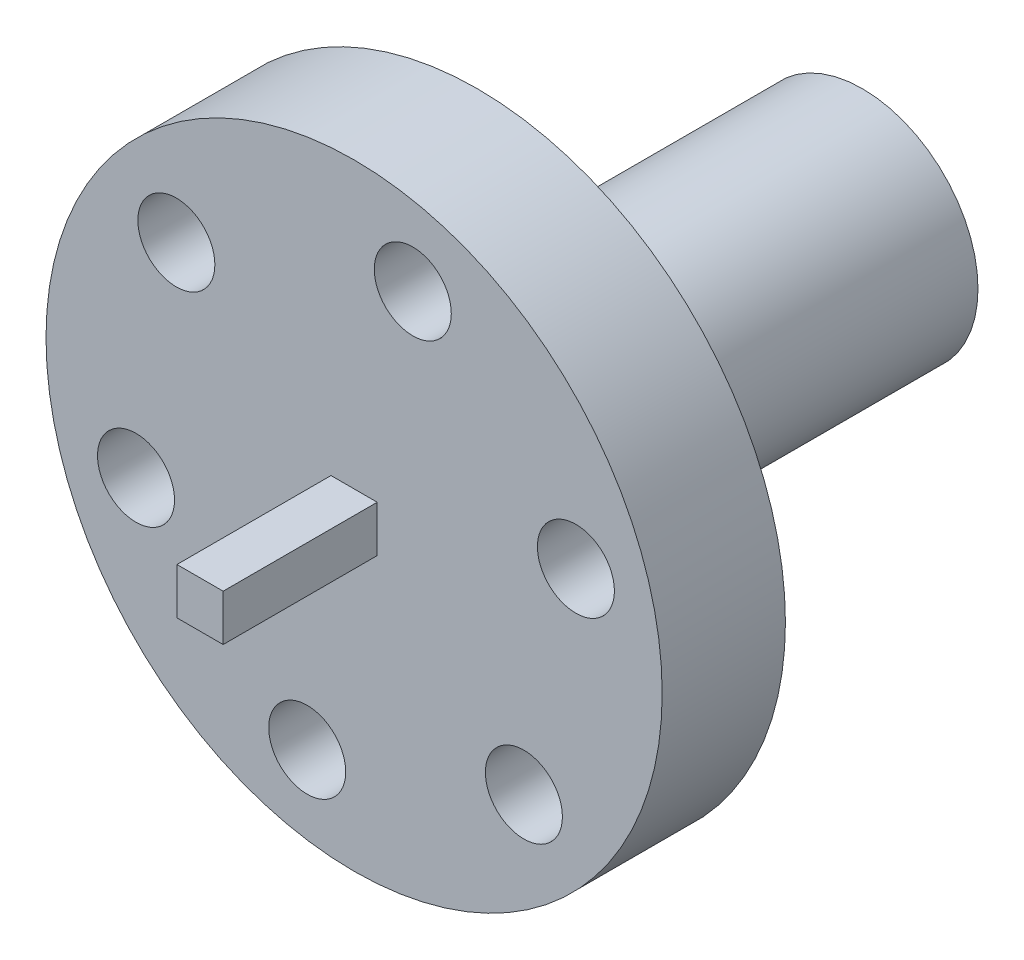
ISO-10303-21;
HEADER;
FILE_DESCRIPTION(('STEP AP214'),'2;1');
FILE_NAME('part.step','',(''),(''),'','','');
FILE_SCHEMA(('AUTOMOTIVE_DESIGN { 1 0 10303 214 1 1 1 1 }'));
ENDSEC;
DATA;
#1=APPLICATION_CONTEXT('core data for automotive mechanical design processes');
#2=APPLICATION_PROTOCOL_DEFINITION('international standard','automotive_design',2000,#1);
#3=PRODUCT_CONTEXT('',#1,'mechanical');
#4=PRODUCT('Part','Part','',(#3));
#5=PRODUCT_RELATED_PRODUCT_CATEGORY('part','',(#4));
#6=PRODUCT_DEFINITION_FORMATION('','',#4);
#7=PRODUCT_DEFINITION_CONTEXT('part definition',#1,'design');
#8=PRODUCT_DEFINITION('design','',#6,#7);
#9=PRODUCT_DEFINITION_SHAPE('','',#8);
#10=(LENGTH_UNIT() NAMED_UNIT(*) SI_UNIT(.MILLI.,.METRE.));
#11=(NAMED_UNIT(*) PLANE_ANGLE_UNIT() SI_UNIT($,.RADIAN.));
#12=(NAMED_UNIT(*) SI_UNIT($,.STERADIAN.) SOLID_ANGLE_UNIT());
#13=UNCERTAINTY_MEASURE_WITH_UNIT(LENGTH_MEASURE(1.E-05),#10,'distance_accuracy_value','');
#14=(GEOMETRIC_REPRESENTATION_CONTEXT(3) GLOBAL_UNCERTAINTY_ASSIGNED_CONTEXT((#13)) GLOBAL_UNIT_ASSIGNED_CONTEXT((#10,
#11,#12)) REPRESENTATION_CONTEXT('',''));
#15=CARTESIAN_POINT('',(0.,0.,0.));
#16=DIRECTION('',(0.,0.,1.));
#17=DIRECTION('',(1.,0.,0.));
#18=AXIS2_PLACEMENT_3D('',#15,#16,#17);
#19=CARTESIAN_POINT('',(0.,0.,8.));
#20=DIRECTION('',(0.,0.,1.));
#21=DIRECTION('',(1.,0.,0.));
#22=AXIS2_PLACEMENT_3D('',#19,#20,#21);
#23=PLANE('',#22);
#24=CARTESIAN_POINT('',(-14.1573634779161,-4.95493457320838,8.));
#25=DIRECTION('',(0.,0.,1.));
#26=DIRECTION('',(1.,0.,0.));
#27=AXIS2_PLACEMENT_3D('',#24,#25,#26);
#28=CIRCLE('',#27,2.5);
#29=CARTESIAN_POINT('',(-11.6573634779161,-4.95493457320838,8.));
#30=VERTEX_POINT('',#29);
#31=EDGE_CURVE('E144',#30,#30,#28,.T.);
#32=ORIENTED_EDGE('',*,*,#31,.F.);
#33=EDGE_LOOP('',(#32));
#34=FACE_BOUND('',#33,.T.);
#35=CARTESIAN_POINT('',(11.0220296676362,-10.1740310292288,8.));
#36=DIRECTION('',(0.,0.,1.));
#37=DIRECTION('',(1.,0.,0.));
#38=AXIS2_PLACEMENT_3D('',#35,#36,#37);
#39=CIRCLE('',#38,2.50000000000001);
#40=CARTESIAN_POINT('',(13.5220296676363,-10.1740310292288,8.));
#41=VERTEX_POINT('',#40);
#42=EDGE_CURVE('E160',#41,#41,#39,.T.);
#43=ORIENTED_EDGE('',*,*,#42,.F.);
#44=EDGE_LOOP('',(#43));
#45=FACE_BOUND('',#44,.T.);
#46=CARTESIAN_POINT('',(3.80920927033514,14.5082709078233,8.));
#47=DIRECTION('',(0.,0.,1.));
#48=DIRECTION('',(1.,0.,0.));
#49=AXIS2_PLACEMENT_3D('',#46,#47,#48);
#50=CIRCLE('',#49,2.50000000000001);
#51=CARTESIAN_POINT('',(6.30920927033515,14.5082709078233,8.));
#52=VERTEX_POINT('',#51);
#53=EDGE_CURVE('E176',#52,#52,#50,.T.);
#54=ORIENTED_EDGE('',*,*,#53,.F.);
#55=EDGE_LOOP('',(#54));
#56=FACE_BOUND('',#55,.T.);
#57=CARTESIAN_POINT('',(0.,0.,8.));
#58=DIRECTION('',(0.,0.,1.));
#59=DIRECTION('',(1.,0.,0.));
#60=AXIS2_PLACEMENT_3D('',#57,#58,#59);
#61=CIRCLE('',#60,20.);
#62=CARTESIAN_POINT('',(20.,0.,8.));
#63=VERTEX_POINT('',#62);
#64=EDGE_CURVE('E54',#63,#63,#61,.T.);
#65=ORIENTED_EDGE('',*,*,#64,.T.);
#66=EDGE_LOOP('',(#65));
#67=FACE_BOUND('',#66,.T.);
#68=CARTESIAN_POINT('',(14.3979067384834,4.20752865667248,8.));
#69=DIRECTION('',(0.,0.,1.));
#70=DIRECTION('',(1.,0.,0.));
#71=AXIS2_PLACEMENT_3D('',#68,#69,#70);
#72=CIRCLE('',#71,2.5);
#73=CARTESIAN_POINT('',(16.8979067384834,4.20752865667248,8.));
#74=VERTEX_POINT('',#73);
#75=EDGE_CURVE('E168',#74,#74,#72,.T.);
#76=ORIENTED_EDGE('',*,*,#75,.F.);
#77=EDGE_LOOP('',(#76));
#78=FACE_BOUND('',#77,.T.);
#79=CARTESIAN_POINT('',(-3.04407825591621,-14.6873904077392,8.));
#80=DIRECTION('',(0.,0.,1.));
#81=DIRECTION('',(1.,0.,0.));
#82=AXIS2_PLACEMENT_3D('',#79,#80,#81);
#83=CIRCLE('',#82,2.50000000000001);
#84=CARTESIAN_POINT('',(-0.544078255916198,-14.6873904077392,8.));
#85=VERTEX_POINT('',#84);
#86=EDGE_CURVE('E152',#85,#85,#83,.T.);
#87=ORIENTED_EDGE('',*,*,#86,.F.);
#88=EDGE_LOOP('',(#87));
#89=FACE_BOUND('',#88,.T.);
#90=CARTESIAN_POINT('',(-11.5387856076938,9.58359543962977,8.));
#91=DIRECTION('',(0.,0.,1.));
#92=DIRECTION('',(1.,0.,0.));
#93=AXIS2_PLACEMENT_3D('',#90,#91,#92);
#94=CIRCLE('',#93,2.5);
#95=CARTESIAN_POINT('',(-9.03878560769384,9.58359543962977,8.));
#96=VERTEX_POINT('',#95);
#97=EDGE_CURVE('E136',#96,#96,#94,.T.);
#98=ORIENTED_EDGE('',*,*,#97,.F.);
#99=EDGE_LOOP('',(#98));
#100=FACE_BOUND('',#99,.T.);
#101=DIRECTION('',(1.,0.,0.));
#102=VECTOR('',#101,1.);
#103=CARTESIAN_POINT('',(1.5,-1.5,8.));
#104=LINE('',#103,#102);
#105=CARTESIAN_POINT('',(-1.5,-1.5,8.));
#106=VERTEX_POINT('',#105);
#107=CARTESIAN_POINT('',(1.5,-1.5,8.));
#108=VERTEX_POINT('',#107);
#109=EDGE_CURVE('E103',#106,#108,#104,.T.);
#110=ORIENTED_EDGE('',*,*,#109,.F.);
#111=DIRECTION('',(0.,-1.,0.));
#112=VECTOR('',#111,1.);
#113=CARTESIAN_POINT('',(-1.5,1.5,8.));
#114=LINE('',#113,#112);
#115=CARTESIAN_POINT('',(-1.5,1.5,8.));
#116=VERTEX_POINT('',#115);
#117=EDGE_CURVE('E117',#116,#106,#114,.T.);
#118=ORIENTED_EDGE('',*,*,#117,.F.);
#119=DIRECTION('',(-1.,0.,0.));
#120=VECTOR('',#119,1.);
#121=CARTESIAN_POINT('',(1.5,1.5,8.));
#122=LINE('',#121,#120);
#123=CARTESIAN_POINT('',(1.5,1.5,8.));
#124=VERTEX_POINT('',#123);
#125=EDGE_CURVE('E83',#124,#116,#122,.T.);
#126=ORIENTED_EDGE('',*,*,#125,.F.);
#127=DIRECTION('',(0.,1.,0.));
#128=VECTOR('',#127,1.);
#129=CARTESIAN_POINT('',(1.5,1.5,8.));
#130=LINE('',#129,#128);
#131=EDGE_CURVE('E124',#108,#124,#130,.T.);
#132=ORIENTED_EDGE('',*,*,#131,.F.);
#133=EDGE_LOOP('',(#110,#118,#126,#132));
#134=FACE_BOUND('',#133,.T.);
#135=ADVANCED_FACE('F45',(#34,#45,#56,#67,#78,#89,#100,#134),#23,.T.);
#136=CARTESIAN_POINT('',(0.,0.,0.));
#137=DIRECTION('',(0.,0.,1.));
#138=DIRECTION('',(1.,0.,0.));
#139=AXIS2_PLACEMENT_3D('',#136,#137,#138);
#140=PLANE('',#139);
#141=CARTESIAN_POINT('',(0.,0.,0.));
#142=DIRECTION('',(0.,0.,1.));
#143=DIRECTION('',(1.,0.,0.));
#144=AXIS2_PLACEMENT_3D('',#141,#142,#143);
#145=CIRCLE('',#144,10.);
#146=CARTESIAN_POINT('',(10.,0.,0.));
#147=VERTEX_POINT('',#146);
#148=EDGE_CURVE('E11',#147,#147,#145,.F.);
#149=ORIENTED_EDGE('',*,*,#148,.F.);
#150=EDGE_LOOP('',(#149));
#151=FACE_BOUND('',#150,.T.);
#152=CARTESIAN_POINT('',(0.,0.,0.));
#153=DIRECTION('',(0.,0.,1.));
#154=DIRECTION('',(1.,0.,0.));
#155=AXIS2_PLACEMENT_3D('',#152,#153,#154);
#156=CIRCLE('',#155,20.);
#157=CARTESIAN_POINT('',(20.,0.,0.));
#158=VERTEX_POINT('',#157);
#159=EDGE_CURVE('E180',#158,#158,#156,.T.);
#160=ORIENTED_EDGE('',*,*,#159,.F.);
#161=EDGE_LOOP('',(#160));
#162=FACE_BOUND('',#161,.T.);
#163=CARTESIAN_POINT('',(3.80920927033514,14.5082709078233,0.));
#164=DIRECTION('',(0.,0.,1.));
#165=DIRECTION('',(1.,0.,0.));
#166=AXIS2_PLACEMENT_3D('',#163,#164,#165);
#167=CIRCLE('',#166,2.50000000000001);
#168=CARTESIAN_POINT('',(6.30920927033515,14.5082709078233,0.));
#169=VERTEX_POINT('',#168);
#170=EDGE_CURVE('E172',#169,#169,#167,.T.);
#171=ORIENTED_EDGE('',*,*,#170,.T.);
#172=EDGE_LOOP('',(#171));
#173=FACE_BOUND('',#172,.T.);
#174=CARTESIAN_POINT('',(14.3979067384834,4.20752865667248,0.));
#175=DIRECTION('',(0.,0.,1.));
#176=DIRECTION('',(1.,0.,0.));
#177=AXIS2_PLACEMENT_3D('',#174,#175,#176);
#178=CIRCLE('',#177,2.5);
#179=CARTESIAN_POINT('',(16.8979067384834,4.20752865667248,0.));
#180=VERTEX_POINT('',#179);
#181=EDGE_CURVE('E164',#180,#180,#178,.T.);
#182=ORIENTED_EDGE('',*,*,#181,.T.);
#183=EDGE_LOOP('',(#182));
#184=FACE_BOUND('',#183,.T.);
#185=CARTESIAN_POINT('',(11.0220296676362,-10.1740310292288,0.));
#186=DIRECTION('',(0.,0.,1.));
#187=DIRECTION('',(1.,0.,0.));
#188=AXIS2_PLACEMENT_3D('',#185,#186,#187);
#189=CIRCLE('',#188,2.50000000000001);
#190=CARTESIAN_POINT('',(13.5220296676363,-10.1740310292288,0.));
#191=VERTEX_POINT('',#190);
#192=EDGE_CURVE('E156',#191,#191,#189,.T.);
#193=ORIENTED_EDGE('',*,*,#192,.T.);
#194=EDGE_LOOP('',(#193));
#195=FACE_BOUND('',#194,.T.);
#196=CARTESIAN_POINT('',(-3.04407825591621,-14.6873904077392,0.));
#197=DIRECTION('',(0.,0.,1.));
#198=DIRECTION('',(1.,0.,0.));
#199=AXIS2_PLACEMENT_3D('',#196,#197,#198);
#200=CIRCLE('',#199,2.50000000000001);
#201=CARTESIAN_POINT('',(-0.544078255916198,-14.6873904077392,0.));
#202=VERTEX_POINT('',#201);
#203=EDGE_CURVE('E148',#202,#202,#200,.T.);
#204=ORIENTED_EDGE('',*,*,#203,.T.);
#205=EDGE_LOOP('',(#204));
#206=FACE_BOUND('',#205,.T.);
#207=CARTESIAN_POINT('',(-14.1573634779161,-4.95493457320838,0.));
#208=DIRECTION('',(0.,0.,1.));
#209=DIRECTION('',(1.,0.,0.));
#210=AXIS2_PLACEMENT_3D('',#207,#208,#209);
#211=CIRCLE('',#210,2.5);
#212=CARTESIAN_POINT('',(-11.6573634779161,-4.95493457320838,0.));
#213=VERTEX_POINT('',#212);
#214=EDGE_CURVE('E140',#213,#213,#211,.T.);
#215=ORIENTED_EDGE('',*,*,#214,.T.);
#216=EDGE_LOOP('',(#215));
#217=FACE_BOUND('',#216,.T.);
#218=CARTESIAN_POINT('',(-11.5387856076938,9.58359543962977,0.));
#219=DIRECTION('',(0.,0.,1.));
#220=DIRECTION('',(1.,0.,0.));
#221=AXIS2_PLACEMENT_3D('',#218,#219,#220);
#222=CIRCLE('',#221,2.5);
#223=CARTESIAN_POINT('',(-9.03878560769384,9.58359543962977,0.));
#224=VERTEX_POINT('',#223);
#225=EDGE_CURVE('E135',#224,#224,#222,.T.);
#226=ORIENTED_EDGE('',*,*,#225,.T.);
#227=EDGE_LOOP('',(#226));
#228=FACE_BOUND('',#227,.T.);
#229=ADVANCED_FACE('F212',(#151,#162,#173,#184,#195,#206,#217,#228),#140,.F.);
#230=CARTESIAN_POINT('',(0.,0.,8.));
#231=DIRECTION('',(0.,0.,-1.));
#232=DIRECTION('',(-1.,0.,0.));
#233=AXIS2_PLACEMENT_3D('',#230,#231,#232);
#234=CYLINDRICAL_SURFACE('',#233,20.);
#235=ORIENTED_EDGE('',*,*,#64,.F.);
#236=EDGE_LOOP('',(#235));
#237=FACE_BOUND('',#236,.T.);
#238=ORIENTED_EDGE('',*,*,#159,.T.);
#239=EDGE_LOOP('',(#238));
#240=FACE_BOUND('',#239,.T.);
#241=ADVANCED_FACE('F47',(#237,#240),#234,.T.);
#242=CARTESIAN_POINT('',(3.80920927033514,14.5082709078233,8.));
#243=DIRECTION('',(0.,0.,-1.));
#244=DIRECTION('',(-1.,0.,0.));
#245=AXIS2_PLACEMENT_3D('',#242,#243,#244);
#246=CYLINDRICAL_SURFACE('',#245,2.50000000000001);
#247=ORIENTED_EDGE('',*,*,#53,.T.);
#248=EDGE_LOOP('',(#247));
#249=FACE_BOUND('',#248,.T.);
#250=ORIENTED_EDGE('',*,*,#170,.F.);
#251=EDGE_LOOP('',(#250));
#252=FACE_BOUND('',#251,.T.);
#253=ADVANCED_FACE('F252',(#249,#252),#246,.F.);
#254=CARTESIAN_POINT('',(14.3979067384834,4.20752865667248,8.));
#255=DIRECTION('',(0.,0.,-1.));
#256=DIRECTION('',(-1.,0.,0.));
#257=AXIS2_PLACEMENT_3D('',#254,#255,#256);
#258=CYLINDRICAL_SURFACE('',#257,2.5);
#259=ORIENTED_EDGE('',*,*,#75,.T.);
#260=EDGE_LOOP('',(#259));
#261=FACE_BOUND('',#260,.T.);
#262=ORIENTED_EDGE('',*,*,#181,.F.);
#263=EDGE_LOOP('',(#262));
#264=FACE_BOUND('',#263,.T.);
#265=ADVANCED_FACE('F255',(#261,#264),#258,.F.);
#266=CARTESIAN_POINT('',(11.0220296676362,-10.1740310292288,8.));
#267=DIRECTION('',(0.,0.,-1.));
#268=DIRECTION('',(-1.,0.,0.));
#269=AXIS2_PLACEMENT_3D('',#266,#267,#268);
#270=CYLINDRICAL_SURFACE('',#269,2.50000000000001);
#271=ORIENTED_EDGE('',*,*,#42,.T.);
#272=EDGE_LOOP('',(#271));
#273=FACE_BOUND('',#272,.T.);
#274=ORIENTED_EDGE('',*,*,#192,.F.);
#275=EDGE_LOOP('',(#274));
#276=FACE_BOUND('',#275,.T.);
#277=ADVANCED_FACE('F259',(#273,#276),#270,.F.);
#278=CARTESIAN_POINT('',(-3.04407825591621,-14.6873904077392,8.));
#279=DIRECTION('',(0.,0.,-1.));
#280=DIRECTION('',(-1.,0.,0.));
#281=AXIS2_PLACEMENT_3D('',#278,#279,#280);
#282=CYLINDRICAL_SURFACE('',#281,2.50000000000001);
#283=ORIENTED_EDGE('',*,*,#86,.T.);
#284=EDGE_LOOP('',(#283));
#285=FACE_BOUND('',#284,.T.);
#286=ORIENTED_EDGE('',*,*,#203,.F.);
#287=EDGE_LOOP('',(#286));
#288=FACE_BOUND('',#287,.T.);
#289=ADVANCED_FACE('F241',(#285,#288),#282,.F.);
#290=CARTESIAN_POINT('',(-14.1573634779161,-4.95493457320838,8.));
#291=DIRECTION('',(0.,0.,-1.));
#292=DIRECTION('',(-1.,0.,0.));
#293=AXIS2_PLACEMENT_3D('',#290,#291,#292);
#294=CYLINDRICAL_SURFACE('',#293,2.5);
#295=ORIENTED_EDGE('',*,*,#31,.T.);
#296=EDGE_LOOP('',(#295));
#297=FACE_BOUND('',#296,.T.);
#298=ORIENTED_EDGE('',*,*,#214,.F.);
#299=EDGE_LOOP('',(#298));
#300=FACE_BOUND('',#299,.T.);
#301=ADVANCED_FACE('F232',(#297,#300),#294,.F.);
#302=CARTESIAN_POINT('',(-11.5387856076938,9.58359543962977,8.));
#303=DIRECTION('',(0.,0.,-1.));
#304=DIRECTION('',(-1.,0.,0.));
#305=AXIS2_PLACEMENT_3D('',#302,#303,#304);
#306=CYLINDRICAL_SURFACE('',#305,2.5);
#307=ORIENTED_EDGE('',*,*,#97,.T.);
#308=EDGE_LOOP('',(#307));
#309=FACE_BOUND('',#308,.T.);
#310=ORIENTED_EDGE('',*,*,#225,.F.);
#311=EDGE_LOOP('',(#310));
#312=FACE_BOUND('',#311,.T.);
#313=ADVANCED_FACE('F229',(#309,#312),#306,.F.);
#314=CARTESIAN_POINT('',(-1.5,1.5,18.));
#315=DIRECTION('',(1.,0.,0.));
#316=DIRECTION('',(0.,1.,0.));
#317=AXIS2_PLACEMENT_3D('',#314,#315,#316);
#318=PLANE('',#317);
#319=ORIENTED_EDGE('',*,*,#117,.T.);
#320=DIRECTION('',(0.,0.,-1.));
#321=VECTOR('',#320,1.);
#322=CARTESIAN_POINT('',(-1.5,-1.5,18.));
#323=LINE('',#322,#321);
#324=CARTESIAN_POINT('',(-1.5,-1.5,18.));
#325=VERTEX_POINT('',#324);
#326=EDGE_CURVE('E107',#325,#106,#323,.T.);
#327=ORIENTED_EDGE('',*,*,#326,.F.);
#328=DIRECTION('',(0.,-1.,0.));
#329=VECTOR('',#328,1.);
#330=CARTESIAN_POINT('',(-1.5,1.5,18.));
#331=LINE('',#330,#329);
#332=CARTESIAN_POINT('',(-1.5,1.5,18.));
#333=VERTEX_POINT('',#332);
#334=EDGE_CURVE('E95',#333,#325,#331,.T.);
#335=ORIENTED_EDGE('',*,*,#334,.F.);
#336=DIRECTION('',(0.,0.,-1.));
#337=VECTOR('',#336,1.);
#338=CARTESIAN_POINT('',(-1.5,1.5,18.));
#339=LINE('',#338,#337);
#340=EDGE_CURVE('E113',#333,#116,#339,.T.);
#341=ORIENTED_EDGE('',*,*,#340,.T.);
#342=EDGE_LOOP('',(#319,#327,#335,#341));
#343=FACE_BOUND('',#342,.T.);
#344=ADVANCED_FACE('F231',(#343),#318,.F.);
#345=CARTESIAN_POINT('',(1.5,-1.5,18.));
#346=DIRECTION('',(0.,1.,0.));
#347=DIRECTION('',(-1.,0.,0.));
#348=AXIS2_PLACEMENT_3D('',#345,#346,#347);
#349=PLANE('',#348);
#350=ORIENTED_EDGE('',*,*,#109,.T.);
#351=DIRECTION('',(0.,0.,-1.));
#352=VECTOR('',#351,1.);
#353=CARTESIAN_POINT('',(1.5,-1.5,18.));
#354=LINE('',#353,#352);
#355=CARTESIAN_POINT('',(1.5,-1.5,18.));
#356=VERTEX_POINT('',#355);
#357=EDGE_CURVE('E100',#356,#108,#354,.T.);
#358=ORIENTED_EDGE('',*,*,#357,.F.);
#359=DIRECTION('',(1.,0.,0.));
#360=VECTOR('',#359,1.);
#361=CARTESIAN_POINT('',(1.5,-1.5,18.));
#362=LINE('',#361,#360);
#363=EDGE_CURVE('E90',#325,#356,#362,.T.);
#364=ORIENTED_EDGE('',*,*,#363,.F.);
#365=ORIENTED_EDGE('',*,*,#326,.T.);
#366=EDGE_LOOP('',(#350,#358,#364,#365));
#367=FACE_BOUND('',#366,.T.);
#368=ADVANCED_FACE('F101',(#367),#349,.F.);
#369=CARTESIAN_POINT('',(1.5,1.5,18.));
#370=DIRECTION('',(-1.,0.,0.));
#371=DIRECTION('',(0.,-1.,0.));
#372=AXIS2_PLACEMENT_3D('',#369,#370,#371);
#373=PLANE('',#372);
#374=ORIENTED_EDGE('',*,*,#131,.T.);
#375=DIRECTION('',(0.,0.,-1.));
#376=VECTOR('',#375,1.);
#377=CARTESIAN_POINT('',(1.5,1.5,18.));
#378=LINE('',#377,#376);
#379=CARTESIAN_POINT('',(1.5,1.5,18.));
#380=VERTEX_POINT('',#379);
#381=EDGE_CURVE('E61',#380,#124,#378,.T.);
#382=ORIENTED_EDGE('',*,*,#381,.F.);
#383=DIRECTION('',(0.,1.,0.));
#384=VECTOR('',#383,1.);
#385=CARTESIAN_POINT('',(1.5,1.5,18.));
#386=LINE('',#385,#384);
#387=EDGE_CURVE('E93',#356,#380,#386,.T.);
#388=ORIENTED_EDGE('',*,*,#387,.F.);
#389=ORIENTED_EDGE('',*,*,#357,.T.);
#390=EDGE_LOOP('',(#374,#382,#388,#389));
#391=FACE_BOUND('',#390,.T.);
#392=ADVANCED_FACE('F109',(#391),#373,.F.);
#393=CARTESIAN_POINT('',(1.5,1.5,18.));
#394=DIRECTION('',(0.,-1.,0.));
#395=DIRECTION('',(1.,0.,0.));
#396=AXIS2_PLACEMENT_3D('',#393,#394,#395);
#397=PLANE('',#396);
#398=ORIENTED_EDGE('',*,*,#125,.T.);
#399=ORIENTED_EDGE('',*,*,#340,.F.);
#400=DIRECTION('',(-1.,0.,0.));
#401=VECTOR('',#400,1.);
#402=CARTESIAN_POINT('',(1.5,1.5,18.));
#403=LINE('',#402,#401);
#404=EDGE_CURVE('E69',#380,#333,#403,.T.);
#405=ORIENTED_EDGE('',*,*,#404,.F.);
#406=ORIENTED_EDGE('',*,*,#381,.T.);
#407=EDGE_LOOP('',(#398,#399,#405,#406));
#408=FACE_BOUND('',#407,.T.);
#409=ADVANCED_FACE('F275',(#408),#397,.F.);
#410=CARTESIAN_POINT('',(0.,0.,18.));
#411=DIRECTION('',(0.,0.,-1.));
#412=DIRECTION('',(-1.,0.,0.));
#413=AXIS2_PLACEMENT_3D('',#410,#411,#412);
#414=PLANE('',#413);
#415=ORIENTED_EDGE('',*,*,#334,.T.);
#416=ORIENTED_EDGE('',*,*,#363,.T.);
#417=ORIENTED_EDGE('',*,*,#387,.T.);
#418=ORIENTED_EDGE('',*,*,#404,.T.);
#419=EDGE_LOOP('',(#415,#416,#417,#418));
#420=FACE_BOUND('',#419,.T.);
#421=ADVANCED_FACE('F91',(#420),#414,.F.);
#422=CARTESIAN_POINT('',(0.,0.,-5.));
#423=DIRECTION('',(0.,0.,1.));
#424=DIRECTION('',(1.,0.,0.));
#425=AXIS2_PLACEMENT_3D('',#422,#423,#424);
#426=CYLINDRICAL_SURFACE('',#425,10.);
#427=CARTESIAN_POINT('',(0.,0.,-5.));
#428=DIRECTION('',(0.,0.,-1.));
#429=DIRECTION('',(-1.,0.,0.));
#430=AXIS2_PLACEMENT_3D('',#427,#428,#429);
#431=CIRCLE('',#430,10.);
#432=CARTESIAN_POINT('',(-10.,0.,-5.));
#433=VERTEX_POINT('',#432);
#434=EDGE_CURVE('E192',#433,#433,#431,.T.);
#435=ORIENTED_EDGE('',*,*,#434,.F.);
#436=EDGE_LOOP('',(#435));
#437=FACE_BOUND('',#436,.T.);
#438=ORIENTED_EDGE('',*,*,#148,.T.);
#439=EDGE_LOOP('',(#438));
#440=FACE_BOUND('',#439,.T.);
#441=ADVANCED_FACE('F206',(#437,#440),#426,.T.);
#442=CARTESIAN_POINT('',(0.,0.,-5.));
#443=DIRECTION('',(0.,0.,-1.));
#444=DIRECTION('',(-1.,0.,0.));
#445=AXIS2_PLACEMENT_3D('',#442,#443,#444);
#446=PLANE('',#445);
#447=CARTESIAN_POINT('',(0.,0.,-5.));
#448=DIRECTION('',(0.,0.,-1.));
#449=DIRECTION('',(-1.,0.,0.));
#450=AXIS2_PLACEMENT_3D('',#447,#448,#449);
#451=CIRCLE('',#450,7.5);
#452=CARTESIAN_POINT('',(-7.5,0.,-5.));
#453=VERTEX_POINT('',#452);
#454=EDGE_CURVE('E189',#453,#453,#451,.T.);
#455=ORIENTED_EDGE('',*,*,#454,.F.);
#456=EDGE_LOOP('',(#455));
#457=FACE_BOUND('',#456,.T.);
#458=ORIENTED_EDGE('',*,*,#434,.T.);
#459=EDGE_LOOP('',(#458));
#460=FACE_BOUND('',#459,.T.);
#461=ADVANCED_FACE('F204',(#457,#460),#446,.T.);
#462=CARTESIAN_POINT('',(0.,0.,-25.));
#463=DIRECTION('',(0.,0.,-1.));
#464=DIRECTION('',(-1.,0.,0.));
#465=AXIS2_PLACEMENT_3D('',#462,#463,#464);
#466=PLANE('',#465);
#467=CARTESIAN_POINT('',(0.,0.,-25.));
#468=DIRECTION('',(0.,0.,-1.));
#469=DIRECTION('',(-1.,0.,0.));
#470=AXIS2_PLACEMENT_3D('',#467,#468,#469);
#471=CIRCLE('',#470,7.5);
#472=CARTESIAN_POINT('',(-7.5,0.,-25.));
#473=VERTEX_POINT('',#472);
#474=EDGE_CURVE('E121',#473,#473,#471,.T.);
#475=ORIENTED_EDGE('',*,*,#474,.T.);
#476=EDGE_LOOP('',(#475));
#477=FACE_BOUND('',#476,.T.);
#478=ADVANCED_FACE('F314',(#477),#466,.T.);
#479=CARTESIAN_POINT('',(0.,0.,-25.));
#480=DIRECTION('',(0.,0.,1.));
#481=DIRECTION('',(1.,0.,0.));
#482=AXIS2_PLACEMENT_3D('',#479,#480,#481);
#483=CYLINDRICAL_SURFACE('',#482,7.5);
#484=ORIENTED_EDGE('',*,*,#454,.T.);
#485=EDGE_LOOP('',(#484));
#486=FACE_BOUND('',#485,.T.);
#487=ORIENTED_EDGE('',*,*,#474,.F.);
#488=EDGE_LOOP('',(#487));
#489=FACE_BOUND('',#488,.T.);
#490=ADVANCED_FACE('F319',(#486,#489),#483,.T.);
#491=CLOSED_SHELL('',(#135,#229,#241,#253,#265,#277,#289,#301,#313,#344,#368,#392,#409,#421,
#441,#461,#478,#490));
#492=MANIFOLD_SOLID_BREP('B2',#491);
#493=ADVANCED_BREP_SHAPE_REPRESENTATION('',(#18,#492),#14);
#494=SHAPE_DEFINITION_REPRESENTATION(#9,#493);
ENDSEC;
END-ISO-10303-21;
